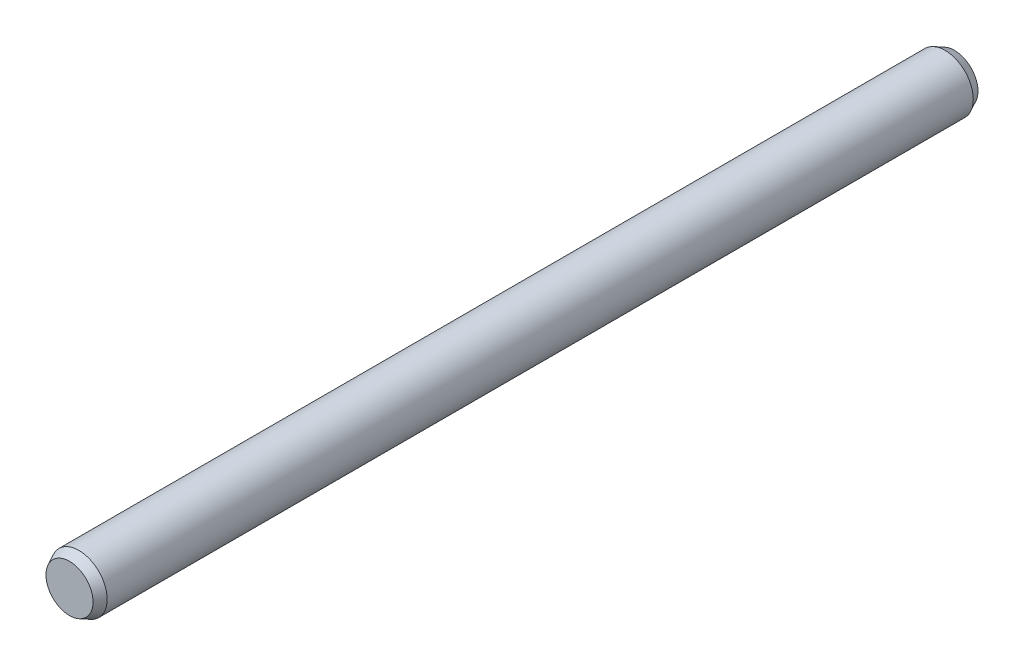
ISO-10303-21;
HEADER;
FILE_DESCRIPTION(('STEP AP214'),'2;1');
FILE_NAME('part.step','',(''),(''),'','','');
FILE_SCHEMA(('AUTOMOTIVE_DESIGN { 1 0 10303 214 1 1 1 1 }'));
ENDSEC;
DATA;
#1=APPLICATION_CONTEXT('core data for automotive mechanical design processes');
#2=APPLICATION_PROTOCOL_DEFINITION('international standard','automotive_design',2000,#1);
#3=PRODUCT_CONTEXT('',#1,'mechanical');
#4=PRODUCT('Part','Part','',(#3));
#5=PRODUCT_RELATED_PRODUCT_CATEGORY('part','',(#4));
#6=PRODUCT_DEFINITION_FORMATION('','',#4);
#7=PRODUCT_DEFINITION_CONTEXT('part definition',#1,'design');
#8=PRODUCT_DEFINITION('design','',#6,#7);
#9=PRODUCT_DEFINITION_SHAPE('','',#8);
#10=(LENGTH_UNIT() NAMED_UNIT(*) SI_UNIT(.MILLI.,.METRE.));
#11=(NAMED_UNIT(*) PLANE_ANGLE_UNIT() SI_UNIT($,.RADIAN.));
#12=(NAMED_UNIT(*) SI_UNIT($,.STERADIAN.) SOLID_ANGLE_UNIT());
#13=UNCERTAINTY_MEASURE_WITH_UNIT(LENGTH_MEASURE(1.E-05),#10,'distance_accuracy_value','');
#14=(GEOMETRIC_REPRESENTATION_CONTEXT(3) GLOBAL_UNCERTAINTY_ASSIGNED_CONTEXT((#13)) GLOBAL_UNIT_ASSIGNED_CONTEXT((#10,
#11,#12)) REPRESENTATION_CONTEXT('',''));
#15=CARTESIAN_POINT('',(0.,0.,0.));
#16=DIRECTION('',(0.,0.,1.));
#17=DIRECTION('',(1.,0.,0.));
#18=AXIS2_PLACEMENT_3D('',#15,#16,#17);
#19=CARTESIAN_POINT('',(0.,0.,47.));
#20=DIRECTION('',(0.,0.,-1.));
#21=DIRECTION('',(-1.,0.,0.));
#22=AXIS2_PLACEMENT_3D('',#19,#20,#21);
#23=CYLINDRICAL_SURFACE('',#22,1.5);
#24=CARTESIAN_POINT('',(0.,0.,0.499999999999973));
#25=DIRECTION('',(0.,0.,1.));
#26=DIRECTION('',(1.,0.,0.));
#27=AXIS2_PLACEMENT_3D('',#24,#25,#26);
#28=CIRCLE('',#27,1.5);
#29=CARTESIAN_POINT('',(1.5,0.,0.499999999999973));
#30=VERTEX_POINT('',#29);
#31=EDGE_CURVE('E62',#30,#30,#28,.T.);
#32=ORIENTED_EDGE('',*,*,#31,.T.);
#33=EDGE_LOOP('',(#32));
#34=FACE_BOUND('',#33,.T.);
#35=CARTESIAN_POINT('',(0.,0.,46.5));
#36=DIRECTION('',(0.,0.,1.));
#37=DIRECTION('',(1.,0.,0.));
#38=AXIS2_PLACEMENT_3D('',#35,#36,#37);
#39=CIRCLE('',#38,1.5);
#40=CARTESIAN_POINT('',(1.5,0.,46.5));
#41=VERTEX_POINT('',#40);
#42=EDGE_CURVE('E67',#41,#41,#39,.F.);
#43=ORIENTED_EDGE('',*,*,#42,.T.);
#44=EDGE_LOOP('',(#43));
#45=FACE_BOUND('',#44,.T.);
#46=ADVANCED_FACE('F53',(#34,#45),#23,.T.);
#47=CARTESIAN_POINT('',(0.,0.,47.));
#48=DIRECTION('',(0.,0.,1.));
#49=DIRECTION('',(1.,0.,0.));
#50=AXIS2_PLACEMENT_3D('',#47,#48,#49);
#51=PLANE('',#50);
#52=CARTESIAN_POINT('',(0.,0.,47.));
#53=DIRECTION('',(0.,0.,1.));
#54=DIRECTION('',(1.,0.,0.));
#55=AXIS2_PLACEMENT_3D('',#52,#53,#54);
#56=CIRCLE('',#55,1.25);
#57=CARTESIAN_POINT('',(1.25,0.,47.));
#58=VERTEX_POINT('',#57);
#59=EDGE_CURVE('E72',#58,#58,#56,.T.);
#60=ORIENTED_EDGE('',*,*,#59,.T.);
#61=EDGE_LOOP('',(#60));
#62=FACE_BOUND('',#61,.T.);
#63=ADVANCED_FACE('F79',(#62),#51,.T.);
#64=CARTESIAN_POINT('',(0.,0.,0.));
#65=DIRECTION('',(0.,0.,1.));
#66=DIRECTION('',(1.,0.,0.));
#67=AXIS2_PLACEMENT_3D('',#64,#65,#66);
#68=PLANE('',#67);
#69=CARTESIAN_POINT('',(0.,0.,0.));
#70=DIRECTION('',(0.,0.,1.));
#71=DIRECTION('',(1.,0.,0.));
#72=AXIS2_PLACEMENT_3D('',#69,#70,#71);
#73=CIRCLE('',#72,1.25000000000002);
#74=CARTESIAN_POINT('',(1.25000000000002,0.,0.));
#75=VERTEX_POINT('',#74);
#76=EDGE_CURVE('E10',#75,#75,#73,.F.);
#77=ORIENTED_EDGE('',*,*,#76,.T.);
#78=EDGE_LOOP('',(#77));
#79=FACE_BOUND('',#78,.T.);
#80=ADVANCED_FACE('F83',(#79),#68,.F.);
#81=CARTESIAN_POINT('',(0.,0.,47.));
#82=DIRECTION('',(0.,0.,-1.));
#83=DIRECTION('',(-1.,0.,0.));
#84=AXIS2_PLACEMENT_3D('',#81,#82,#83);
#85=CONICAL_SURFACE('',#84,1.25,0.463647609000804);
#86=ORIENTED_EDGE('',*,*,#42,.F.);
#87=EDGE_LOOP('',(#86));
#88=FACE_BOUND('',#87,.T.);
#89=ORIENTED_EDGE('',*,*,#59,.F.);
#90=EDGE_LOOP('',(#89));
#91=FACE_BOUND('',#90,.T.);
#92=ADVANCED_FACE('F81',(#88,#91),#85,.T.);
#93=CARTESIAN_POINT('',(0.,0.,0.499999999999973));
#94=DIRECTION('',(0.,0.,1.));
#95=DIRECTION('',(1.,0.,0.));
#96=AXIS2_PLACEMENT_3D('',#93,#94,#95);
#97=CONICAL_SURFACE('',#96,1.5,0.463647609000798);
#98=ORIENTED_EDGE('',*,*,#76,.F.);
#99=EDGE_LOOP('',(#98));
#100=FACE_BOUND('',#99,.T.);
#101=ORIENTED_EDGE('',*,*,#31,.F.);
#102=EDGE_LOOP('',(#101));
#103=FACE_BOUND('',#102,.T.);
#104=ADVANCED_FACE('F56',(#100,#103),#97,.T.);
#105=CLOSED_SHELL('',(#46,#63,#80,#92,#104));
#106=MANIFOLD_SOLID_BREP('B2',#105);
#107=ADVANCED_BREP_SHAPE_REPRESENTATION('',(#18,#106),#14);
#108=SHAPE_DEFINITION_REPRESENTATION(#9,#107);
ENDSEC;
END-ISO-10303-21;
